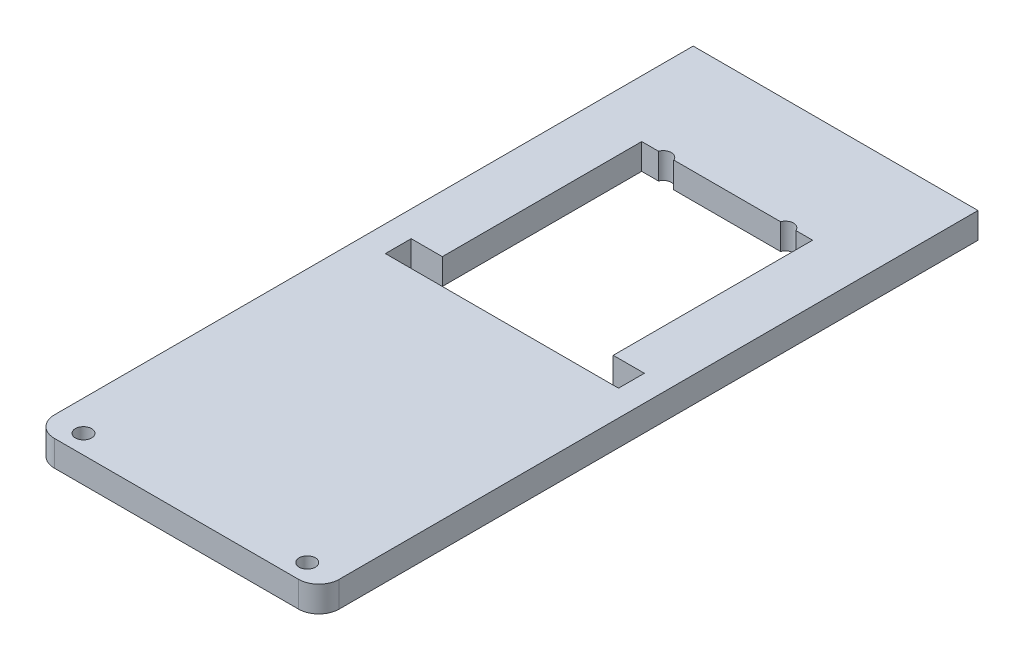
ISO-10303-21;
HEADER;
FILE_DESCRIPTION(('STEP AP214'),'2;1');
FILE_NAME('part.step','',(''),(''),'','','');
FILE_SCHEMA(('AUTOMOTIVE_DESIGN { 1 0 10303 214 1 1 1 1 }'));
ENDSEC;
DATA;
#1=APPLICATION_CONTEXT('core data for automotive mechanical design processes');
#2=APPLICATION_PROTOCOL_DEFINITION('international standard','automotive_design',2000,#1);
#3=PRODUCT_CONTEXT('',#1,'mechanical');
#4=PRODUCT('Part','Part','',(#3));
#5=PRODUCT_RELATED_PRODUCT_CATEGORY('part','',(#4));
#6=PRODUCT_DEFINITION_FORMATION('','',#4);
#7=PRODUCT_DEFINITION_CONTEXT('part definition',#1,'design');
#8=PRODUCT_DEFINITION('design','',#6,#7);
#9=PRODUCT_DEFINITION_SHAPE('','',#8);
#10=(LENGTH_UNIT() NAMED_UNIT(*) SI_UNIT(.MILLI.,.METRE.));
#11=(NAMED_UNIT(*) PLANE_ANGLE_UNIT() SI_UNIT($,.RADIAN.));
#12=(NAMED_UNIT(*) SI_UNIT($,.STERADIAN.) SOLID_ANGLE_UNIT());
#13=UNCERTAINTY_MEASURE_WITH_UNIT(LENGTH_MEASURE(1.E-05),#10,'distance_accuracy_value','');
#14=(GEOMETRIC_REPRESENTATION_CONTEXT(3) GLOBAL_UNCERTAINTY_ASSIGNED_CONTEXT((#13)) GLOBAL_UNIT_ASSIGNED_CONTEXT((#10,
#11,#12)) REPRESENTATION_CONTEXT('',''));
#15=CARTESIAN_POINT('',(0.,0.,0.));
#16=DIRECTION('',(0.,0.,1.));
#17=DIRECTION('',(1.,0.,0.));
#18=AXIS2_PLACEMENT_3D('',#15,#16,#17);
#19=CARTESIAN_POINT('',(0.,-3.175,64.65));
#20=DIRECTION('',(0.,0.,-1.));
#21=DIRECTION('',(-1.,0.,0.));
#22=AXIS2_PLACEMENT_3D('',#19,#20,#21);
#23=PLANE('',#22);
#24=DIRECTION('',(-1.,0.,0.));
#25=VECTOR('',#24,1.);
#26=CARTESIAN_POINT('',(0.,-3.175,64.65));
#27=LINE('',#26,#25);
#28=CARTESIAN_POINT('',(-16.8734993995195,-3.175,64.65));
#29=VERTEX_POINT('',#28);
#30=CARTESIAN_POINT('',(-21.,-3.175,64.65));
#31=VERTEX_POINT('',#30);
#32=EDGE_CURVE('E223',#29,#31,#27,.T.);
#33=ORIENTED_EDGE('',*,*,#32,.F.);
#34=DIRECTION('',(0.,1.,0.));
#35=VECTOR('',#34,1.);
#36=CARTESIAN_POINT('',(-16.8734993995195,-3.175,64.65));
#37=LINE('',#36,#35);
#38=CARTESIAN_POINT('',(-16.8734993995195,3.175,64.65));
#39=VERTEX_POINT('',#38);
#40=EDGE_CURVE('E11',#29,#39,#37,.T.);
#41=ORIENTED_EDGE('',*,*,#40,.T.);
#42=DIRECTION('',(-1.,0.,0.));
#43=VECTOR('',#42,1.);
#44=CARTESIAN_POINT('',(0.,3.175,64.65));
#45=LINE('',#44,#43);
#46=CARTESIAN_POINT('',(-21.,3.175,64.65));
#47=VERTEX_POINT('',#46);
#48=EDGE_CURVE('E187',#39,#47,#45,.T.);
#49=ORIENTED_EDGE('',*,*,#48,.T.);
#50=DIRECTION('',(0.,1.,0.));
#51=VECTOR('',#50,1.);
#52=CARTESIAN_POINT('',(-21.,-3.175,64.65));
#53=LINE('',#52,#51);
#54=EDGE_CURVE('E351',#31,#47,#53,.T.);
#55=ORIENTED_EDGE('',*,*,#54,.F.);
#56=EDGE_LOOP('',(#33,#41,#49,#55));
#57=FACE_BOUND('',#56,.T.);
#58=ADVANCED_FACE('F37',(#57),#23,.F.);
#59=CARTESIAN_POINT('',(13.1265006004805,3.175,64.65));
#60=VERTEX_POINT('',#59);
#61=CARTESIAN_POINT('',(-13.1265006004805,3.175,64.65));
#62=VERTEX_POINT('',#61);
#63=EDGE_CURVE('E180',#60,#62,#45,.T.);
#64=ORIENTED_EDGE('',*,*,#63,.T.);
#65=DIRECTION('',(0.,1.,0.));
#66=VECTOR('',#65,1.);
#67=CARTESIAN_POINT('',(-13.1265006004805,-3.175,64.65));
#68=LINE('',#67,#66);
#69=CARTESIAN_POINT('',(-13.1265006004805,-3.175,64.65));
#70=VERTEX_POINT('',#69);
#71=EDGE_CURVE('E45',#62,#70,#68,.F.);
#72=ORIENTED_EDGE('',*,*,#71,.T.);
#73=CARTESIAN_POINT('',(13.1265006004805,-3.175,64.65));
#74=VERTEX_POINT('',#73);
#75=EDGE_CURVE('E222',#74,#70,#27,.T.);
#76=ORIENTED_EDGE('',*,*,#75,.F.);
#77=DIRECTION('',(0.,1.,0.));
#78=VECTOR('',#77,1.);
#79=CARTESIAN_POINT('',(13.1265006004805,-3.175,64.65));
#80=LINE('',#79,#78);
#81=EDGE_CURVE('E168',#74,#60,#80,.T.);
#82=ORIENTED_EDGE('',*,*,#81,.T.);
#83=EDGE_LOOP('',(#64,#72,#76,#82));
#84=FACE_BOUND('',#83,.T.);
#85=ADVANCED_FACE('F266',(#84),#23,.F.);
#86=CARTESIAN_POINT('',(0.,3.175,0.));
#87=DIRECTION('',(0.,1.,0.));
#88=DIRECTION('',(0.,0.,1.));
#89=AXIS2_PLACEMENT_3D('',#86,#87,#88);
#90=PLANE('',#89);
#91=CARTESIAN_POINT('',(27.5,3.175,195.35));
#92=DIRECTION('',(0.,1.,0.));
#93=DIRECTION('',(0.,0.,1.));
#94=AXIS2_PLACEMENT_3D('',#91,#92,#93);
#95=CIRCLE('',#94,2.00000000000001);
#96=CARTESIAN_POINT('',(27.5,3.175,197.35));
#97=VERTEX_POINT('',#96);
#98=EDGE_CURVE('E246',#97,#97,#95,.T.);
#99=ORIENTED_EDGE('',*,*,#98,.F.);
#100=EDGE_LOOP('',(#99));
#101=FACE_BOUND('',#100,.T.);
#102=CARTESIAN_POINT('',(-15.,3.175,65.3500000000001));
#103=DIRECTION('',(0.,1.,0.));
#104=DIRECTION('',(0.,0.,1.));
#105=AXIS2_PLACEMENT_3D('',#102,#103,#104);
#106=CIRCLE('',#105,2.);
#107=EDGE_CURVE('E247',#62,#39,#106,.T.);
#108=ORIENTED_EDGE('',*,*,#107,.F.);
#109=ORIENTED_EDGE('',*,*,#63,.F.);
#110=CARTESIAN_POINT('',(15.,3.175,65.3500000000001));
#111=DIRECTION('',(0.,1.,0.));
#112=DIRECTION('',(0.,0.,1.));
#113=AXIS2_PLACEMENT_3D('',#110,#111,#112);
#114=CIRCLE('',#113,2.00000000000001);
#115=CARTESIAN_POINT('',(16.8734993995195,3.175,64.65));
#116=VERTEX_POINT('',#115);
#117=EDGE_CURVE('E162',#116,#60,#114,.T.);
#118=ORIENTED_EDGE('',*,*,#117,.F.);
#119=CARTESIAN_POINT('',(21.,3.175,64.65));
#120=VERTEX_POINT('',#119);
#121=EDGE_CURVE('E178',#120,#116,#45,.T.);
#122=ORIENTED_EDGE('',*,*,#121,.F.);
#123=DIRECTION('',(0.,0.,-1.));
#124=VECTOR('',#123,1.);
#125=CARTESIAN_POINT('',(21.,3.175,0.));
#126=LINE('',#125,#124);
#127=CARTESIAN_POINT('',(21.,3.175,113.65));
#128=VERTEX_POINT('',#127);
#129=EDGE_CURVE('E193',#128,#120,#126,.T.);
#130=ORIENTED_EDGE('',*,*,#129,.F.);
#131=DIRECTION('',(1.,0.,0.));
#132=VECTOR('',#131,1.);
#133=CARTESIAN_POINT('',(0.,3.175,113.65));
#134=LINE('',#133,#132);
#135=CARTESIAN_POINT('',(28.65,3.175,113.65));
#136=VERTEX_POINT('',#135);
#137=EDGE_CURVE('E198',#128,#136,#134,.T.);
#138=ORIENTED_EDGE('',*,*,#137,.T.);
#139=DIRECTION('',(0.,0.,-1.));
#140=VECTOR('',#139,1.);
#141=CARTESIAN_POINT('',(28.65,3.175,0.));
#142=LINE('',#141,#140);
#143=CARTESIAN_POINT('',(28.65,3.175,120.));
#144=VERTEX_POINT('',#143);
#145=EDGE_CURVE('E201',#144,#136,#142,.T.);
#146=ORIENTED_EDGE('',*,*,#145,.F.);
#147=DIRECTION('',(-1.,0.,0.));
#148=VECTOR('',#147,1.);
#149=CARTESIAN_POINT('',(0.,3.175,120.));
#150=LINE('',#149,#148);
#151=CARTESIAN_POINT('',(-28.65,3.175,120.));
#152=VERTEX_POINT('',#151);
#153=EDGE_CURVE('E206',#144,#152,#150,.T.);
#154=ORIENTED_EDGE('',*,*,#153,.T.);
#155=DIRECTION('',(0.,0.,-1.));
#156=VECTOR('',#155,1.);
#157=CARTESIAN_POINT('',(-28.6500000000001,3.175,0.));
#158=LINE('',#157,#156);
#159=CARTESIAN_POINT('',(-28.65,3.175,113.65));
#160=VERTEX_POINT('',#159);
#161=EDGE_CURVE('E209',#152,#160,#158,.T.);
#162=ORIENTED_EDGE('',*,*,#161,.T.);
#163=DIRECTION('',(-1.,0.,0.));
#164=VECTOR('',#163,1.);
#165=CARTESIAN_POINT('',(0.,3.175,113.65));
#166=LINE('',#165,#164);
#167=CARTESIAN_POINT('',(-21.,3.175,113.65));
#168=VERTEX_POINT('',#167);
#169=EDGE_CURVE('E212',#168,#160,#166,.T.);
#170=ORIENTED_EDGE('',*,*,#169,.F.);
#171=DIRECTION('',(0.,0.,-1.));
#172=VECTOR('',#171,1.);
#173=CARTESIAN_POINT('',(-21.,3.175,0.));
#174=LINE('',#173,#172);
#175=EDGE_CURVE('E215',#168,#47,#174,.T.);
#176=ORIENTED_EDGE('',*,*,#175,.T.);
#177=ORIENTED_EDGE('',*,*,#48,.F.);
#178=EDGE_LOOP('',(#108,#109,#118,#122,#130,#138,#146,#154,#162,#170,#176,#177));
#179=FACE_BOUND('',#178,.T.);
#180=CARTESIAN_POINT('',(-27.5,3.175,195.35));
#181=DIRECTION('',(0.,1.,0.));
#182=DIRECTION('',(0.,0.,1.));
#183=AXIS2_PLACEMENT_3D('',#180,#181,#182);
#184=CIRCLE('',#183,2.00000000000001);
#185=CARTESIAN_POINT('',(-27.5,3.175,197.35));
#186=VERTEX_POINT('',#185);
#187=EDGE_CURVE('E240',#186,#186,#184,.T.);
#188=ORIENTED_EDGE('',*,*,#187,.F.);
#189=EDGE_LOOP('',(#188));
#190=FACE_BOUND('',#189,.T.);
#191=DIRECTION('',(1.,0.,0.));
#192=VECTOR('',#191,1.);
#193=CARTESIAN_POINT('',(0.,3.175,200.));
#194=LINE('',#193,#192);
#195=CARTESIAN_POINT('',(-30.,3.175,200.));
#196=VERTEX_POINT('',#195);
#197=CARTESIAN_POINT('',(30.,3.175,200.));
#198=VERTEX_POINT('',#197);
#199=EDGE_CURVE('E360',#196,#198,#194,.T.);
#200=ORIENTED_EDGE('',*,*,#199,.T.);
#201=CARTESIAN_POINT('',(30.,3.175,195.));
#202=DIRECTION('',(0.,1.,0.));
#203=DIRECTION('',(0.,0.,1.));
#204=AXIS2_PLACEMENT_3D('',#201,#202,#203);
#205=CIRCLE('',#204,5.);
#206=CARTESIAN_POINT('',(35.,3.175,195.));
#207=VERTEX_POINT('',#206);
#208=EDGE_CURVE('E386',#198,#207,#205,.T.);
#209=ORIENTED_EDGE('',*,*,#208,.T.);
#210=DIRECTION('',(0.,0.,-1.));
#211=VECTOR('',#210,1.);
#212=CARTESIAN_POINT('',(35.,3.175,0.));
#213=LINE('',#212,#211);
#214=CARTESIAN_POINT('',(35.,3.175,38.));
#215=VERTEX_POINT('',#214);
#216=EDGE_CURVE('E364',#207,#215,#213,.T.);
#217=ORIENTED_EDGE('',*,*,#216,.T.);
#218=DIRECTION('',(-1.,0.,0.));
#219=VECTOR('',#218,1.);
#220=CARTESIAN_POINT('',(0.,3.175,38.));
#221=LINE('',#220,#219);
#222=CARTESIAN_POINT('',(-35.,3.175,38.));
#223=VERTEX_POINT('',#222);
#224=EDGE_CURVE('E348',#215,#223,#221,.T.);
#225=ORIENTED_EDGE('',*,*,#224,.T.);
#226=DIRECTION('',(0.,0.,1.));
#227=VECTOR('',#226,1.);
#228=CARTESIAN_POINT('',(-35.,3.175,0.));
#229=LINE('',#228,#227);
#230=CARTESIAN_POINT('',(-35.,3.175,195.));
#231=VERTEX_POINT('',#230);
#232=EDGE_CURVE('E357',#223,#231,#229,.T.);
#233=ORIENTED_EDGE('',*,*,#232,.T.);
#234=CARTESIAN_POINT('',(-30.,3.175,195.));
#235=DIRECTION('',(0.,1.,0.));
#236=DIRECTION('',(0.,0.,1.));
#237=AXIS2_PLACEMENT_3D('',#234,#235,#236);
#238=CIRCLE('',#237,5.);
#239=EDGE_CURVE('E384',#231,#196,#238,.T.);
#240=ORIENTED_EDGE('',*,*,#239,.T.);
#241=EDGE_LOOP('',(#200,#209,#217,#225,#233,#240));
#242=FACE_BOUND('',#241,.T.);
#243=ADVANCED_FACE('F175',(#101,#179,#190,#242),#90,.T.);
#244=CARTESIAN_POINT('',(0.,-3.175,0.));
#245=DIRECTION('',(0.,1.,0.));
#246=DIRECTION('',(0.,0.,1.));
#247=AXIS2_PLACEMENT_3D('',#244,#245,#246);
#248=PLANE('',#247);
#249=CARTESIAN_POINT('',(27.5,-3.175,195.35));
#250=DIRECTION('',(0.,1.,0.));
#251=DIRECTION('',(0.,0.,1.));
#252=AXIS2_PLACEMENT_3D('',#249,#250,#251);
#253=CIRCLE('',#252,2.00000000000001);
#254=CARTESIAN_POINT('',(27.5,-3.175,197.35));
#255=VERTEX_POINT('',#254);
#256=EDGE_CURVE('E218',#255,#255,#253,.T.);
#257=ORIENTED_EDGE('',*,*,#256,.T.);
#258=EDGE_LOOP('',(#257));
#259=FACE_BOUND('',#258,.T.);
#260=CARTESIAN_POINT('',(-27.5,-3.175,195.35));
#261=DIRECTION('',(0.,1.,0.));
#262=DIRECTION('',(0.,0.,1.));
#263=AXIS2_PLACEMENT_3D('',#260,#261,#262);
#264=CIRCLE('',#263,2.00000000000001);
#265=CARTESIAN_POINT('',(-27.5,-3.175,197.35));
#266=VERTEX_POINT('',#265);
#267=EDGE_CURVE('E243',#266,#266,#264,.T.);
#268=ORIENTED_EDGE('',*,*,#267,.T.);
#269=EDGE_LOOP('',(#268));
#270=FACE_BOUND('',#269,.T.);
#271=DIRECTION('',(0.,0.,-1.));
#272=VECTOR('',#271,1.);
#273=CARTESIAN_POINT('',(35.,-3.175,0.));
#274=LINE('',#273,#272);
#275=CARTESIAN_POINT('',(35.,-3.175,195.));
#276=VERTEX_POINT('',#275);
#277=CARTESIAN_POINT('',(35.,-3.175,38.));
#278=VERTEX_POINT('',#277);
#279=EDGE_CURVE('E361',#276,#278,#274,.T.);
#280=ORIENTED_EDGE('',*,*,#279,.F.);
#281=CARTESIAN_POINT('',(30.,-3.175,195.));
#282=DIRECTION('',(0.,1.,0.));
#283=DIRECTION('',(0.,0.,1.));
#284=AXIS2_PLACEMENT_3D('',#281,#282,#283);
#285=CIRCLE('',#284,5.);
#286=CARTESIAN_POINT('',(30.,-3.175,200.));
#287=VERTEX_POINT('',#286);
#288=EDGE_CURVE('E377',#276,#287,#285,.F.);
#289=ORIENTED_EDGE('',*,*,#288,.T.);
#290=DIRECTION('',(1.,0.,0.));
#291=VECTOR('',#290,1.);
#292=CARTESIAN_POINT('',(0.,-3.175,200.));
#293=LINE('',#292,#291);
#294=CARTESIAN_POINT('',(-30.,-3.175,200.));
#295=VERTEX_POINT('',#294);
#296=EDGE_CURVE('E369',#295,#287,#293,.T.);
#297=ORIENTED_EDGE('',*,*,#296,.F.);
#298=CARTESIAN_POINT('',(-30.,-3.175,195.));
#299=DIRECTION('',(0.,1.,0.));
#300=DIRECTION('',(0.,0.,1.));
#301=AXIS2_PLACEMENT_3D('',#298,#299,#300);
#302=CIRCLE('',#301,5.);
#303=CARTESIAN_POINT('',(-35.,-3.175,195.));
#304=VERTEX_POINT('',#303);
#305=EDGE_CURVE('E375',#295,#304,#302,.F.);
#306=ORIENTED_EDGE('',*,*,#305,.T.);
#307=DIRECTION('',(0.,0.,1.));
#308=VECTOR('',#307,1.);
#309=CARTESIAN_POINT('',(-35.,-3.175,0.));
#310=LINE('',#309,#308);
#311=CARTESIAN_POINT('',(-35.,-3.175,38.));
#312=VERTEX_POINT('',#311);
#313=EDGE_CURVE('E354',#312,#304,#310,.T.);
#314=ORIENTED_EDGE('',*,*,#313,.F.);
#315=DIRECTION('',(-1.,0.,0.));
#316=VECTOR('',#315,1.);
#317=CARTESIAN_POINT('',(0.,-3.175,38.));
#318=LINE('',#317,#316);
#319=EDGE_CURVE('E345',#278,#312,#318,.T.);
#320=ORIENTED_EDGE('',*,*,#319,.F.);
#321=EDGE_LOOP('',(#280,#289,#297,#306,#314,#320));
#322=FACE_BOUND('',#321,.T.);
#323=ORIENTED_EDGE('',*,*,#75,.T.);
#324=CARTESIAN_POINT('',(-15.,-3.175,65.3500000000001));
#325=DIRECTION('',(0.,1.,0.));
#326=DIRECTION('',(0.,0.,1.));
#327=AXIS2_PLACEMENT_3D('',#324,#325,#326);
#328=CIRCLE('',#327,2.);
#329=EDGE_CURVE('E52',#70,#29,#328,.T.);
#330=ORIENTED_EDGE('',*,*,#329,.T.);
#331=ORIENTED_EDGE('',*,*,#32,.T.);
#332=DIRECTION('',(0.,0.,-1.));
#333=VECTOR('',#332,1.);
#334=CARTESIAN_POINT('',(-21.,-3.175,0.));
#335=LINE('',#334,#333);
#336=CARTESIAN_POINT('',(-21.,-3.175,113.65));
#337=VERTEX_POINT('',#336);
#338=EDGE_CURVE('E185',#337,#31,#335,.T.);
#339=ORIENTED_EDGE('',*,*,#338,.F.);
#340=DIRECTION('',(-1.,0.,0.));
#341=VECTOR('',#340,1.);
#342=CARTESIAN_POINT('',(0.,-3.175,113.65));
#343=LINE('',#342,#341);
#344=CARTESIAN_POINT('',(-28.65,-3.175,113.65));
#345=VERTEX_POINT('',#344);
#346=EDGE_CURVE('E189',#337,#345,#343,.T.);
#347=ORIENTED_EDGE('',*,*,#346,.T.);
#348=DIRECTION('',(0.,0.,-1.));
#349=VECTOR('',#348,1.);
#350=CARTESIAN_POINT('',(-28.6500000000001,-3.175,0.));
#351=LINE('',#350,#349);
#352=CARTESIAN_POINT('',(-28.65,-3.175,120.));
#353=VERTEX_POINT('',#352);
#354=EDGE_CURVE('E234',#353,#345,#351,.T.);
#355=ORIENTED_EDGE('',*,*,#354,.F.);
#356=DIRECTION('',(-1.,0.,0.));
#357=VECTOR('',#356,1.);
#358=CARTESIAN_POINT('',(0.,-3.175,120.));
#359=LINE('',#358,#357);
#360=CARTESIAN_POINT('',(28.65,-3.175,120.));
#361=VERTEX_POINT('',#360);
#362=EDGE_CURVE('E232',#361,#353,#359,.T.);
#363=ORIENTED_EDGE('',*,*,#362,.F.);
#364=DIRECTION('',(0.,0.,-1.));
#365=VECTOR('',#364,1.);
#366=CARTESIAN_POINT('',(28.65,-3.175,0.));
#367=LINE('',#366,#365);
#368=CARTESIAN_POINT('',(28.65,-3.175,113.65));
#369=VERTEX_POINT('',#368);
#370=EDGE_CURVE('E229',#361,#369,#367,.T.);
#371=ORIENTED_EDGE('',*,*,#370,.T.);
#372=DIRECTION('',(1.,0.,0.));
#373=VECTOR('',#372,1.);
#374=CARTESIAN_POINT('',(0.,-3.175,113.65));
#375=LINE('',#374,#373);
#376=CARTESIAN_POINT('',(21.,-3.175,113.65));
#377=VERTEX_POINT('',#376);
#378=EDGE_CURVE('E227',#377,#369,#375,.T.);
#379=ORIENTED_EDGE('',*,*,#378,.F.);
#380=DIRECTION('',(0.,0.,-1.));
#381=VECTOR('',#380,1.);
#382=CARTESIAN_POINT('',(21.,-3.175,0.));
#383=LINE('',#382,#381);
#384=CARTESIAN_POINT('',(21.,-3.175,64.65));
#385=VERTEX_POINT('',#384);
#386=EDGE_CURVE('E224',#377,#385,#383,.T.);
#387=ORIENTED_EDGE('',*,*,#386,.T.);
#388=CARTESIAN_POINT('',(16.8734993995195,-3.175,64.65));
#389=VERTEX_POINT('',#388);
#390=EDGE_CURVE('E219',#385,#389,#27,.T.);
#391=ORIENTED_EDGE('',*,*,#390,.T.);
#392=CARTESIAN_POINT('',(15.,-3.175,65.3500000000001));
#393=DIRECTION('',(0.,1.,0.));
#394=DIRECTION('',(0.,0.,1.));
#395=AXIS2_PLACEMENT_3D('',#392,#393,#394);
#396=CIRCLE('',#395,2.00000000000001);
#397=EDGE_CURVE('E60',#389,#74,#396,.T.);
#398=ORIENTED_EDGE('',*,*,#397,.T.);
#399=EDGE_LOOP('',(#323,#330,#331,#339,#347,#355,#363,#371,#379,#387,#391,#398));
#400=FACE_BOUND('',#399,.T.);
#401=ADVANCED_FACE('F255',(#259,#270,#322,#400),#248,.F.);
#402=CARTESIAN_POINT('',(-35.,3.175,0.));
#403=DIRECTION('',(1.,0.,0.));
#404=DIRECTION('',(0.,0.,-1.));
#405=AXIS2_PLACEMENT_3D('',#402,#403,#404);
#406=PLANE('',#405);
#407=ORIENTED_EDGE('',*,*,#313,.T.);
#408=DIRECTION('',(0.,-1.,0.));
#409=VECTOR('',#408,1.);
#410=CARTESIAN_POINT('',(-35.,3.175,195.));
#411=LINE('',#410,#409);
#412=EDGE_CURVE('E169',#304,#231,#411,.F.);
#413=ORIENTED_EDGE('',*,*,#412,.T.);
#414=ORIENTED_EDGE('',*,*,#232,.F.);
#415=DIRECTION('',(0.,1.,0.));
#416=VECTOR('',#415,1.);
#417=CARTESIAN_POINT('',(-35.,-3.175,38.));
#418=LINE('',#417,#416);
#419=EDGE_CURVE('E352',#312,#223,#418,.T.);
#420=ORIENTED_EDGE('',*,*,#419,.F.);
#421=EDGE_LOOP('',(#407,#413,#414,#420));
#422=FACE_BOUND('',#421,.T.);
#423=ADVANCED_FACE('F272',(#422),#406,.F.);
#424=CARTESIAN_POINT('',(35.,3.175,0.));
#425=DIRECTION('',(-1.,0.,0.));
#426=DIRECTION('',(0.,0.,1.));
#427=AXIS2_PLACEMENT_3D('',#424,#425,#426);
#428=PLANE('',#427);
#429=ORIENTED_EDGE('',*,*,#216,.F.);
#430=DIRECTION('',(0.,-1.,0.));
#431=VECTOR('',#430,1.);
#432=CARTESIAN_POINT('',(35.,3.175,195.));
#433=LINE('',#432,#431);
#434=EDGE_CURVE('E366',#207,#276,#433,.T.);
#435=ORIENTED_EDGE('',*,*,#434,.T.);
#436=ORIENTED_EDGE('',*,*,#279,.T.);
#437=DIRECTION('',(0.,1.,0.));
#438=VECTOR('',#437,1.);
#439=CARTESIAN_POINT('',(35.,-3.175,38.));
#440=LINE('',#439,#438);
#441=EDGE_CURVE('E347',#278,#215,#440,.T.);
#442=ORIENTED_EDGE('',*,*,#441,.T.);
#443=EDGE_LOOP('',(#429,#435,#436,#442));
#444=FACE_BOUND('',#443,.T.);
#445=ADVANCED_FACE('F427',(#444),#428,.F.);
#446=CARTESIAN_POINT('',(0.,3.175,200.));
#447=DIRECTION('',(0.,0.,-1.));
#448=DIRECTION('',(-1.,0.,0.));
#449=AXIS2_PLACEMENT_3D('',#446,#447,#448);
#450=PLANE('',#449);
#451=ORIENTED_EDGE('',*,*,#296,.T.);
#452=DIRECTION('',(0.,-1.,0.));
#453=VECTOR('',#452,1.);
#454=CARTESIAN_POINT('',(30.,3.175,200.));
#455=LINE('',#454,#453);
#456=EDGE_CURVE('E382',#287,#198,#455,.F.);
#457=ORIENTED_EDGE('',*,*,#456,.T.);
#458=ORIENTED_EDGE('',*,*,#199,.F.);
#459=DIRECTION('',(0.,-1.,0.));
#460=VECTOR('',#459,1.);
#461=CARTESIAN_POINT('',(-30.,3.175,200.));
#462=LINE('',#461,#460);
#463=EDGE_CURVE('E379',#196,#295,#462,.T.);
#464=ORIENTED_EDGE('',*,*,#463,.T.);
#465=EDGE_LOOP('',(#451,#457,#458,#464));
#466=FACE_BOUND('',#465,.T.);
#467=ADVANCED_FACE('F297',(#466),#450,.F.);
#468=CARTESIAN_POINT('',(0.,-3.175,38.));
#469=DIRECTION('',(0.,0.,-1.));
#470=DIRECTION('',(-1.,0.,0.));
#471=AXIS2_PLACEMENT_3D('',#468,#469,#470);
#472=PLANE('',#471);
#473=ORIENTED_EDGE('',*,*,#224,.F.);
#474=ORIENTED_EDGE('',*,*,#441,.F.);
#475=ORIENTED_EDGE('',*,*,#319,.T.);
#476=ORIENTED_EDGE('',*,*,#419,.T.);
#477=EDGE_LOOP('',(#473,#474,#475,#476));
#478=FACE_BOUND('',#477,.T.);
#479=ADVANCED_FACE('F291',(#478),#472,.T.);
#480=CARTESIAN_POINT('',(-21.,-3.175,0.));
#481=DIRECTION('',(1.,0.,0.));
#482=DIRECTION('',(0.,0.,-1.));
#483=AXIS2_PLACEMENT_3D('',#480,#481,#482);
#484=PLANE('',#483);
#485=ORIENTED_EDGE('',*,*,#175,.F.);
#486=DIRECTION('',(0.,1.,0.));
#487=VECTOR('',#486,1.);
#488=CARTESIAN_POINT('',(-21.,-3.175,113.65));
#489=LINE('',#488,#487);
#490=EDGE_CURVE('E221',#337,#168,#489,.T.);
#491=ORIENTED_EDGE('',*,*,#490,.F.);
#492=ORIENTED_EDGE('',*,*,#338,.T.);
#493=ORIENTED_EDGE('',*,*,#54,.T.);
#494=EDGE_LOOP('',(#485,#491,#492,#493));
#495=FACE_BOUND('',#494,.T.);
#496=ADVANCED_FACE('F285',(#495),#484,.T.);
#497=ORIENTED_EDGE('',*,*,#121,.T.);
#498=DIRECTION('',(0.,1.,0.));
#499=VECTOR('',#498,1.);
#500=CARTESIAN_POINT('',(16.8734993995195,-3.175,64.65));
#501=LINE('',#500,#499);
#502=EDGE_CURVE('E159',#116,#389,#501,.F.);
#503=ORIENTED_EDGE('',*,*,#502,.T.);
#504=ORIENTED_EDGE('',*,*,#390,.F.);
#505=DIRECTION('',(0.,1.,0.));
#506=VECTOR('',#505,1.);
#507=CARTESIAN_POINT('',(21.,-3.175,64.65));
#508=LINE('',#507,#506);
#509=EDGE_CURVE('E183',#385,#120,#508,.T.);
#510=ORIENTED_EDGE('',*,*,#509,.T.);
#511=EDGE_LOOP('',(#497,#503,#504,#510));
#512=FACE_BOUND('',#511,.T.);
#513=ADVANCED_FACE('F182',(#512),#23,.F.);
#514=CARTESIAN_POINT('',(21.,-3.175,0.));
#515=DIRECTION('',(1.,0.,0.));
#516=DIRECTION('',(0.,0.,-1.));
#517=AXIS2_PLACEMENT_3D('',#514,#515,#516);
#518=PLANE('',#517);
#519=ORIENTED_EDGE('',*,*,#129,.T.);
#520=ORIENTED_EDGE('',*,*,#509,.F.);
#521=ORIENTED_EDGE('',*,*,#386,.F.);
#522=DIRECTION('',(0.,1.,0.));
#523=VECTOR('',#522,1.);
#524=CARTESIAN_POINT('',(21.,-3.175,113.65));
#525=LINE('',#524,#523);
#526=EDGE_CURVE('E322',#377,#128,#525,.T.);
#527=ORIENTED_EDGE('',*,*,#526,.T.);
#528=EDGE_LOOP('',(#519,#520,#521,#527));
#529=FACE_BOUND('',#528,.T.);
#530=ADVANCED_FACE('F284',(#529),#518,.F.);
#531=CARTESIAN_POINT('',(0.,-3.175,113.65));
#532=DIRECTION('',(0.,0.,1.));
#533=DIRECTION('',(1.,0.,0.));
#534=AXIS2_PLACEMENT_3D('',#531,#532,#533);
#535=PLANE('',#534);
#536=ORIENTED_EDGE('',*,*,#137,.F.);
#537=ORIENTED_EDGE('',*,*,#526,.F.);
#538=ORIENTED_EDGE('',*,*,#378,.T.);
#539=DIRECTION('',(0.,1.,0.));
#540=VECTOR('',#539,1.);
#541=CARTESIAN_POINT('',(28.65,-3.175,113.65));
#542=LINE('',#541,#540);
#543=EDGE_CURVE('E325',#369,#136,#542,.T.);
#544=ORIENTED_EDGE('',*,*,#543,.T.);
#545=EDGE_LOOP('',(#536,#537,#538,#544));
#546=FACE_BOUND('',#545,.T.);
#547=ADVANCED_FACE('F290',(#546),#535,.T.);
#548=CARTESIAN_POINT('',(28.65,-3.175,0.));
#549=DIRECTION('',(1.,0.,0.));
#550=DIRECTION('',(0.,0.,-1.));
#551=AXIS2_PLACEMENT_3D('',#548,#549,#550);
#552=PLANE('',#551);
#553=ORIENTED_EDGE('',*,*,#145,.T.);
#554=ORIENTED_EDGE('',*,*,#543,.F.);
#555=ORIENTED_EDGE('',*,*,#370,.F.);
#556=DIRECTION('',(0.,1.,0.));
#557=VECTOR('',#556,1.);
#558=CARTESIAN_POINT('',(28.65,-3.175,120.));
#559=LINE('',#558,#557);
#560=EDGE_CURVE('E329',#361,#144,#559,.T.);
#561=ORIENTED_EDGE('',*,*,#560,.T.);
#562=EDGE_LOOP('',(#553,#554,#555,#561));
#563=FACE_BOUND('',#562,.T.);
#564=ADVANCED_FACE('F312',(#563),#552,.F.);
#565=CARTESIAN_POINT('',(0.,-3.175,120.));
#566=DIRECTION('',(0.,0.,-1.));
#567=DIRECTION('',(-1.,0.,0.));
#568=AXIS2_PLACEMENT_3D('',#565,#566,#567);
#569=PLANE('',#568);
#570=ORIENTED_EDGE('',*,*,#153,.F.);
#571=ORIENTED_EDGE('',*,*,#560,.F.);
#572=ORIENTED_EDGE('',*,*,#362,.T.);
#573=DIRECTION('',(0.,1.,0.));
#574=VECTOR('',#573,1.);
#575=CARTESIAN_POINT('',(-28.65,-3.175,120.));
#576=LINE('',#575,#574);
#577=EDGE_CURVE('E331',#353,#152,#576,.T.);
#578=ORIENTED_EDGE('',*,*,#577,.T.);
#579=EDGE_LOOP('',(#570,#571,#572,#578));
#580=FACE_BOUND('',#579,.T.);
#581=ADVANCED_FACE('F308',(#580),#569,.T.);
#582=CARTESIAN_POINT('',(-28.6500000000001,-3.175,0.));
#583=DIRECTION('',(1.,0.,0.));
#584=DIRECTION('',(0.,0.,-1.));
#585=AXIS2_PLACEMENT_3D('',#582,#583,#584);
#586=PLANE('',#585);
#587=ORIENTED_EDGE('',*,*,#161,.F.);
#588=ORIENTED_EDGE('',*,*,#577,.F.);
#589=ORIENTED_EDGE('',*,*,#354,.T.);
#590=DIRECTION('',(0.,1.,0.));
#591=VECTOR('',#590,1.);
#592=CARTESIAN_POINT('',(-28.65,-3.175,113.65));
#593=LINE('',#592,#591);
#594=EDGE_CURVE('E336',#345,#160,#593,.T.);
#595=ORIENTED_EDGE('',*,*,#594,.T.);
#596=EDGE_LOOP('',(#587,#588,#589,#595));
#597=FACE_BOUND('',#596,.T.);
#598=ADVANCED_FACE('F304',(#597),#586,.T.);
#599=CARTESIAN_POINT('',(0.,-3.175,113.65));
#600=DIRECTION('',(0.,0.,-1.));
#601=DIRECTION('',(-1.,0.,0.));
#602=AXIS2_PLACEMENT_3D('',#599,#600,#601);
#603=PLANE('',#602);
#604=ORIENTED_EDGE('',*,*,#169,.T.);
#605=ORIENTED_EDGE('',*,*,#594,.F.);
#606=ORIENTED_EDGE('',*,*,#346,.F.);
#607=ORIENTED_EDGE('',*,*,#490,.T.);
#608=EDGE_LOOP('',(#604,#605,#606,#607));
#609=FACE_BOUND('',#608,.T.);
#610=ADVANCED_FACE('F300',(#609),#603,.F.);
#611=CARTESIAN_POINT('',(30.,3.175,195.));
#612=DIRECTION('',(0.,-1.,0.));
#613=DIRECTION('',(0.,0.,-1.));
#614=AXIS2_PLACEMENT_3D('',#611,#612,#613);
#615=CYLINDRICAL_SURFACE('',#614,5.);
#616=ORIENTED_EDGE('',*,*,#208,.F.);
#617=ORIENTED_EDGE('',*,*,#456,.F.);
#618=ORIENTED_EDGE('',*,*,#288,.F.);
#619=ORIENTED_EDGE('',*,*,#434,.F.);
#620=EDGE_LOOP('',(#616,#617,#618,#619));
#621=FACE_BOUND('',#620,.T.);
#622=ADVANCED_FACE('F303',(#621),#615,.T.);
#623=CARTESIAN_POINT('',(-30.,3.175,195.));
#624=DIRECTION('',(0.,-1.,0.));
#625=DIRECTION('',(0.,0.,-1.));
#626=AXIS2_PLACEMENT_3D('',#623,#624,#625);
#627=CYLINDRICAL_SURFACE('',#626,5.);
#628=ORIENTED_EDGE('',*,*,#239,.F.);
#629=ORIENTED_EDGE('',*,*,#412,.F.);
#630=ORIENTED_EDGE('',*,*,#305,.F.);
#631=ORIENTED_EDGE('',*,*,#463,.F.);
#632=EDGE_LOOP('',(#628,#629,#630,#631));
#633=FACE_BOUND('',#632,.T.);
#634=ADVANCED_FACE('F39',(#633),#627,.T.);
#635=CARTESIAN_POINT('',(15.,-3.175,65.3500000000001));
#636=DIRECTION('',(0.,1.,0.));
#637=DIRECTION('',(0.,0.,1.));
#638=AXIS2_PLACEMENT_3D('',#635,#636,#637);
#639=CYLINDRICAL_SURFACE('',#638,2.00000000000001);
#640=ORIENTED_EDGE('',*,*,#397,.F.);
#641=ORIENTED_EDGE('',*,*,#502,.F.);
#642=ORIENTED_EDGE('',*,*,#117,.T.);
#643=ORIENTED_EDGE('',*,*,#81,.F.);
#644=EDGE_LOOP('',(#640,#641,#642,#643));
#645=FACE_BOUND('',#644,.T.);
#646=ADVANCED_FACE('F161',(#645),#639,.F.);
#647=CARTESIAN_POINT('',(-15.,-3.175,65.3500000000001));
#648=DIRECTION('',(0.,1.,0.));
#649=DIRECTION('',(0.,0.,1.));
#650=AXIS2_PLACEMENT_3D('',#647,#648,#649);
#651=CYLINDRICAL_SURFACE('',#650,2.);
#652=ORIENTED_EDGE('',*,*,#329,.F.);
#653=ORIENTED_EDGE('',*,*,#71,.F.);
#654=ORIENTED_EDGE('',*,*,#107,.T.);
#655=ORIENTED_EDGE('',*,*,#40,.F.);
#656=EDGE_LOOP('',(#652,#653,#654,#655));
#657=FACE_BOUND('',#656,.T.);
#658=ADVANCED_FACE('F396',(#657),#651,.F.);
#659=CARTESIAN_POINT('',(-27.5,-3.175,195.35));
#660=DIRECTION('',(0.,1.,0.));
#661=DIRECTION('',(0.,0.,1.));
#662=AXIS2_PLACEMENT_3D('',#659,#660,#661);
#663=CYLINDRICAL_SURFACE('',#662,2.00000000000001);
#664=ORIENTED_EDGE('',*,*,#267,.F.);
#665=EDGE_LOOP('',(#664));
#666=FACE_BOUND('',#665,.T.);
#667=ORIENTED_EDGE('',*,*,#187,.T.);
#668=EDGE_LOOP('',(#667));
#669=FACE_BOUND('',#668,.T.);
#670=ADVANCED_FACE('F261',(#666,#669),#663,.F.);
#671=CARTESIAN_POINT('',(27.5,-3.175,195.35));
#672=DIRECTION('',(0.,1.,0.));
#673=DIRECTION('',(0.,0.,1.));
#674=AXIS2_PLACEMENT_3D('',#671,#672,#673);
#675=CYLINDRICAL_SURFACE('',#674,2.00000000000001);
#676=ORIENTED_EDGE('',*,*,#256,.F.);
#677=EDGE_LOOP('',(#676));
#678=FACE_BOUND('',#677,.T.);
#679=ORIENTED_EDGE('',*,*,#98,.T.);
#680=EDGE_LOOP('',(#679));
#681=FACE_BOUND('',#680,.T.);
#682=ADVANCED_FACE('F258',(#678,#681),#675,.F.);
#683=CLOSED_SHELL('',(#58,#85,#243,#401,#423,#445,#467,#479,#496,#513,#530,#547,#564,#581,#598,
#610,#622,#634,#646,#658,#670,#682));
#684=MANIFOLD_SOLID_BREP('B2',#683);
#685=ADVANCED_BREP_SHAPE_REPRESENTATION('',(#18,#684),#14);
#686=SHAPE_DEFINITION_REPRESENTATION(#9,#685);
ENDSEC;
END-ISO-10303-21;
